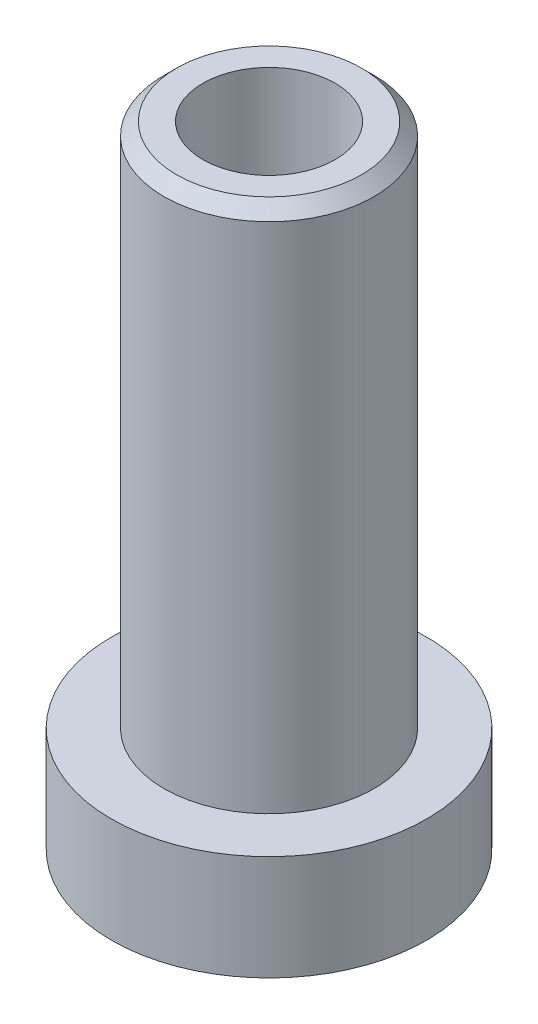
ISO-10303-21;
HEADER;
FILE_DESCRIPTION(('STEP AP214'),'2;1');
FILE_NAME('part.step','',(''),(''),'','','');
FILE_SCHEMA(('AUTOMOTIVE_DESIGN { 1 0 10303 214 1 1 1 1 }'));
ENDSEC;
DATA;
#1=APPLICATION_CONTEXT('core data for automotive mechanical design processes');
#2=APPLICATION_PROTOCOL_DEFINITION('international standard','automotive_design',2000,#1);
#3=PRODUCT_CONTEXT('',#1,'mechanical');
#4=PRODUCT('Part','Part','',(#3));
#5=PRODUCT_RELATED_PRODUCT_CATEGORY('part','',(#4));
#6=PRODUCT_DEFINITION_FORMATION('','',#4);
#7=PRODUCT_DEFINITION_CONTEXT('part definition',#1,'design');
#8=PRODUCT_DEFINITION('design','',#6,#7);
#9=PRODUCT_DEFINITION_SHAPE('','',#8);
#10=(LENGTH_UNIT() NAMED_UNIT(*) SI_UNIT(.MILLI.,.METRE.));
#11=(NAMED_UNIT(*) PLANE_ANGLE_UNIT() SI_UNIT($,.RADIAN.));
#12=(NAMED_UNIT(*) SI_UNIT($,.STERADIAN.) SOLID_ANGLE_UNIT());
#13=UNCERTAINTY_MEASURE_WITH_UNIT(LENGTH_MEASURE(1.E-05),#10,'distance_accuracy_value','');
#14=(GEOMETRIC_REPRESENTATION_CONTEXT(3) GLOBAL_UNCERTAINTY_ASSIGNED_CONTEXT((#13)) GLOBAL_UNIT_ASSIGNED_CONTEXT((#10,
#11,#12)) REPRESENTATION_CONTEXT('',''));
#15=CARTESIAN_POINT('',(0.,0.,0.));
#16=DIRECTION('',(0.,0.,1.));
#17=DIRECTION('',(1.,0.,0.));
#18=AXIS2_PLACEMENT_3D('',#15,#16,#17);
#19=CARTESIAN_POINT('',(0.,0.5,0.));
#20=DIRECTION('',(0.,-1.,0.));
#21=DIRECTION('',(0.,0.,-1.));
#22=AXIS2_PLACEMENT_3D('',#19,#20,#21);
#23=CYLINDRICAL_SURFACE('',#22,0.75);
#24=CARTESIAN_POINT('',(0.,0.5,0.));
#25=DIRECTION('',(0.,1.,0.));
#26=DIRECTION('',(0.,0.,1.));
#27=AXIS2_PLACEMENT_3D('',#24,#25,#26);
#28=CIRCLE('',#27,0.75);
#29=CARTESIAN_POINT('',(0.,0.5,0.75));
#30=VERTEX_POINT('',#29);
#31=EDGE_CURVE('E53',#30,#30,#28,.T.);
#32=ORIENTED_EDGE('',*,*,#31,.F.);
#33=EDGE_LOOP('',(#32));
#34=FACE_BOUND('',#33,.T.);
#35=CARTESIAN_POINT('',(0.,0.,0.));
#36=DIRECTION('',(0.,1.,0.));
#37=DIRECTION('',(0.,0.,1.));
#38=AXIS2_PLACEMENT_3D('',#35,#36,#37);
#39=CIRCLE('',#38,0.75);
#40=CARTESIAN_POINT('',(0.,0.,0.75));
#41=VERTEX_POINT('',#40);
#42=EDGE_CURVE('E56',#41,#41,#39,.T.);
#43=ORIENTED_EDGE('',*,*,#42,.T.);
#44=EDGE_LOOP('',(#43));
#45=FACE_BOUND('',#44,.T.);
#46=ADVANCED_FACE('F37',(#34,#45),#23,.T.);
#47=CARTESIAN_POINT('',(0.,0.5,0.));
#48=DIRECTION('',(0.,1.,0.));
#49=DIRECTION('',(0.,0.,1.));
#50=AXIS2_PLACEMENT_3D('',#47,#48,#49);
#51=PLANE('',#50);
#52=CARTESIAN_POINT('',(0.,0.5,0.));
#53=DIRECTION('',(0.,1.,0.));
#54=DIRECTION('',(0.,0.,1.));
#55=AXIS2_PLACEMENT_3D('',#52,#53,#54);
#56=CIRCLE('',#55,0.5);
#57=CARTESIAN_POINT('',(0.,0.5,0.5));
#58=VERTEX_POINT('',#57);
#59=EDGE_CURVE('E49',#58,#58,#56,.T.);
#60=ORIENTED_EDGE('',*,*,#59,.F.);
#61=EDGE_LOOP('',(#60));
#62=FACE_BOUND('',#61,.T.);
#63=ORIENTED_EDGE('',*,*,#31,.T.);
#64=EDGE_LOOP('',(#63));
#65=FACE_BOUND('',#64,.T.);
#66=ADVANCED_FACE('F74',(#62,#65),#51,.T.);
#67=CARTESIAN_POINT('',(0.,0.,0.));
#68=DIRECTION('',(0.,1.,0.));
#69=DIRECTION('',(0.,0.,1.));
#70=AXIS2_PLACEMENT_3D('',#67,#68,#69);
#71=PLANE('',#70);
#72=CARTESIAN_POINT('',(0.,0.,0.));
#73=DIRECTION('',(0.,-1.,0.));
#74=DIRECTION('',(0.,0.,-1.));
#75=AXIS2_PLACEMENT_3D('',#72,#73,#74);
#76=CIRCLE('',#75,0.315);
#77=CARTESIAN_POINT('',(0.,0.,-0.315));
#78=VERTEX_POINT('',#77);
#79=EDGE_CURVE('E59',#78,#78,#76,.T.);
#80=ORIENTED_EDGE('',*,*,#79,.F.);
#81=EDGE_LOOP('',(#80));
#82=FACE_BOUND('',#81,.T.);
#83=ORIENTED_EDGE('',*,*,#42,.F.);
#84=EDGE_LOOP('',(#83));
#85=FACE_BOUND('',#84,.T.);
#86=ADVANCED_FACE('F70',(#82,#85),#71,.F.);
#87=CARTESIAN_POINT('',(0.,3.,0.));
#88=DIRECTION('',(0.,-1.,0.));
#89=DIRECTION('',(0.,0.,-1.));
#90=AXIS2_PLACEMENT_3D('',#87,#88,#89);
#91=CYLINDRICAL_SURFACE('',#90,0.5);
#92=CARTESIAN_POINT('',(0.,2.94,0.));
#93=DIRECTION('',(0.,1.,0.));
#94=DIRECTION('',(0.,0.,1.));
#95=AXIS2_PLACEMENT_3D('',#92,#93,#94);
#96=CIRCLE('',#95,0.5);
#97=CARTESIAN_POINT('',(0.,2.94,0.5));
#98=VERTEX_POINT('',#97);
#99=EDGE_CURVE('E10',#98,#98,#96,.F.);
#100=ORIENTED_EDGE('',*,*,#99,.T.);
#101=EDGE_LOOP('',(#100));
#102=FACE_BOUND('',#101,.T.);
#103=ORIENTED_EDGE('',*,*,#59,.T.);
#104=EDGE_LOOP('',(#103));
#105=FACE_BOUND('',#104,.T.);
#106=ADVANCED_FACE('F73',(#102,#105),#91,.T.);
#107=CARTESIAN_POINT('',(0.,3.,0.));
#108=DIRECTION('',(0.,1.,0.));
#109=DIRECTION('',(0.,0.,1.));
#110=AXIS2_PLACEMENT_3D('',#107,#108,#109);
#111=PLANE('',#110);
#112=CARTESIAN_POINT('',(0.,3.,0.));
#113=DIRECTION('',(0.,1.,0.));
#114=DIRECTION('',(0.,0.,1.));
#115=AXIS2_PLACEMENT_3D('',#112,#113,#114);
#116=CIRCLE('',#115,0.315);
#117=CARTESIAN_POINT('',(0.,3.,0.315));
#118=VERTEX_POINT('',#117);
#119=EDGE_CURVE('E62',#118,#118,#116,.F.);
#120=ORIENTED_EDGE('',*,*,#119,.T.);
#121=EDGE_LOOP('',(#120));
#122=FACE_BOUND('',#121,.T.);
#123=CARTESIAN_POINT('',(0.,3.,0.));
#124=DIRECTION('',(0.,1.,0.));
#125=DIRECTION('',(0.,0.,1.));
#126=AXIS2_PLACEMENT_3D('',#123,#124,#125);
#127=CIRCLE('',#126,0.44);
#128=CARTESIAN_POINT('',(0.,3.,0.44));
#129=VERTEX_POINT('',#128);
#130=EDGE_CURVE('E45',#129,#129,#127,.T.);
#131=ORIENTED_EDGE('',*,*,#130,.T.);
#132=EDGE_LOOP('',(#131));
#133=FACE_BOUND('',#132,.T.);
#134=ADVANCED_FACE('F89',(#122,#133),#111,.T.);
#135=CARTESIAN_POINT('',(0.,3.,0.));
#136=DIRECTION('',(0.,-1.,0.));
#137=DIRECTION('',(0.,0.,-1.));
#138=AXIS2_PLACEMENT_3D('',#135,#136,#137);
#139=CONICAL_SURFACE('',#138,0.44,0.785398163397445);
#140=ORIENTED_EDGE('',*,*,#99,.F.);
#141=EDGE_LOOP('',(#140));
#142=FACE_BOUND('',#141,.T.);
#143=ORIENTED_EDGE('',*,*,#130,.F.);
#144=EDGE_LOOP('',(#143));
#145=FACE_BOUND('',#144,.T.);
#146=ADVANCED_FACE('F40',(#142,#145),#139,.T.);
#147=CARTESIAN_POINT('',(0.,3.001,0.));
#148=DIRECTION('',(0.,-1.,0.));
#149=DIRECTION('',(0.,0.,-1.));
#150=AXIS2_PLACEMENT_3D('',#147,#148,#149);
#151=CYLINDRICAL_SURFACE('',#150,0.315);
#152=ORIENTED_EDGE('',*,*,#119,.F.);
#153=EDGE_LOOP('',(#152));
#154=FACE_BOUND('',#153,.T.);
#155=ORIENTED_EDGE('',*,*,#79,.T.);
#156=EDGE_LOOP('',(#155));
#157=FACE_BOUND('',#156,.T.);
#158=ADVANCED_FACE('F68',(#154,#157),#151,.F.);
#159=CLOSED_SHELL('',(#46,#66,#86,#106,#134,#146,#158));
#160=MANIFOLD_SOLID_BREP('B2',#159);
#161=ADVANCED_BREP_SHAPE_REPRESENTATION('',(#18,#160),#14);
#162=SHAPE_DEFINITION_REPRESENTATION(#9,#161);
ENDSEC;
END-ISO-10303-21;
